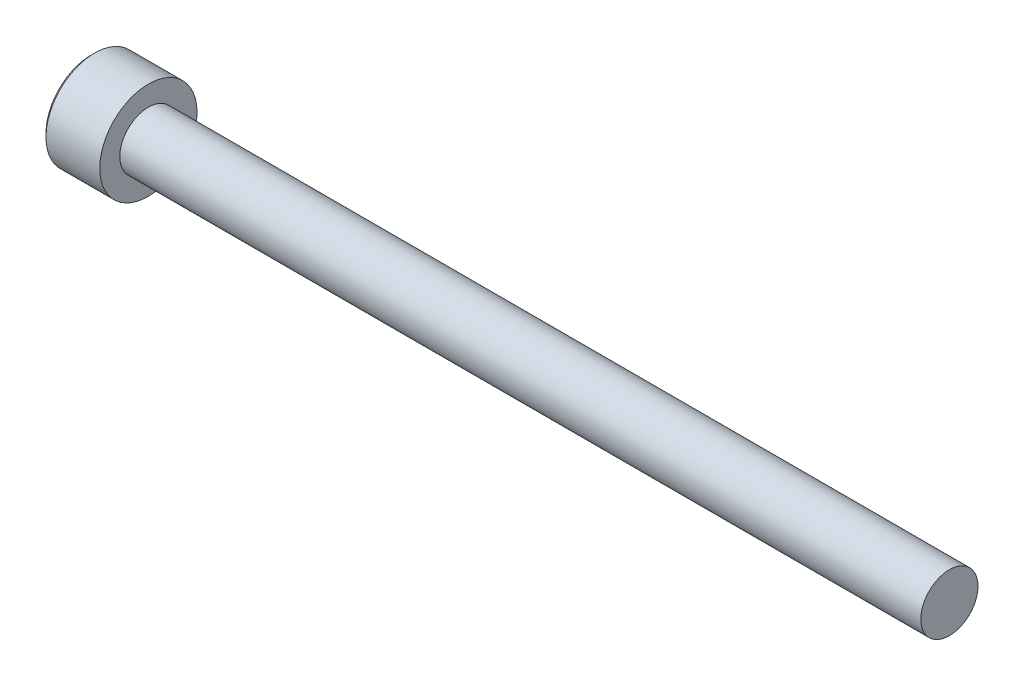
ISO-10303-21;
HEADER;
FILE_DESCRIPTION(('STEP AP214'),'2;1');
FILE_NAME('part.step','',(''),(''),'','','');
FILE_SCHEMA(('AUTOMOTIVE_DESIGN { 1 0 10303 214 1 1 1 1 }'));
ENDSEC;
DATA;
#1=APPLICATION_CONTEXT('core data for automotive mechanical design processes');
#2=APPLICATION_PROTOCOL_DEFINITION('international standard','automotive_design',2000,#1);
#3=PRODUCT_CONTEXT('',#1,'mechanical');
#4=PRODUCT('Part','Part','',(#3));
#5=PRODUCT_RELATED_PRODUCT_CATEGORY('part','',(#4));
#6=PRODUCT_DEFINITION_FORMATION('','',#4);
#7=PRODUCT_DEFINITION_CONTEXT('part definition',#1,'design');
#8=PRODUCT_DEFINITION('design','',#6,#7);
#9=PRODUCT_DEFINITION_SHAPE('','',#8);
#10=(LENGTH_UNIT() NAMED_UNIT(*) SI_UNIT(.MILLI.,.METRE.));
#11=(NAMED_UNIT(*) PLANE_ANGLE_UNIT() SI_UNIT($,.RADIAN.));
#12=(NAMED_UNIT(*) SI_UNIT($,.STERADIAN.) SOLID_ANGLE_UNIT());
#13=UNCERTAINTY_MEASURE_WITH_UNIT(LENGTH_MEASURE(1.E-05),#10,'distance_accuracy_value','');
#14=(GEOMETRIC_REPRESENTATION_CONTEXT(3) GLOBAL_UNCERTAINTY_ASSIGNED_CONTEXT((#13)) GLOBAL_UNIT_ASSIGNED_CONTEXT((#10,
#11,#12)) REPRESENTATION_CONTEXT('',''));
#15=CARTESIAN_POINT('',(0.,0.,0.));
#16=DIRECTION('',(0.,0.,1.));
#17=DIRECTION('',(1.,0.,0.));
#18=AXIS2_PLACEMENT_3D('',#15,#16,#17);
#19=CARTESIAN_POINT('',(-2.5,0.,0.));
#20=DIRECTION('',(-1.,0.,0.));
#21=DIRECTION('',(0.,0.,1.));
#22=AXIS2_PLACEMENT_3D('',#19,#20,#21);
#23=PLANE('',#22);
#24=CARTESIAN_POINT('',(-2.5,0.,0.));
#25=DIRECTION('',(-1.,0.,0.));
#26=DIRECTION('',(0.,-1.,0.));
#27=AXIS2_PLACEMENT_3D('',#24,#25,#26);
#28=CIRCLE('',#27,2.);
#29=CARTESIAN_POINT('',(-2.5,-1.73205080756888,1.));
#30=VERTEX_POINT('',#29);
#31=CARTESIAN_POINT('',(-2.5,0.,2.));
#32=VERTEX_POINT('',#31);
#33=EDGE_CURVE('E47',#30,#32,#28,.T.);
#34=ORIENTED_EDGE('',*,*,#33,.F.);
#35=DIRECTION('',(0.,0.5,0.866025403784439));
#36=VECTOR('',#35,1.);
#37=CARTESIAN_POINT('',(-2.5,-2.3094010767585,0.));
#38=LINE('',#37,#36);
#39=CARTESIAN_POINT('',(-2.5,-1.15470053837925,2.));
#40=VERTEX_POINT('',#39);
#41=EDGE_CURVE('E229',#30,#40,#38,.T.);
#42=ORIENTED_EDGE('',*,*,#41,.T.);
#43=DIRECTION('',(0.,1.,0.));
#44=VECTOR('',#43,1.);
#45=CARTESIAN_POINT('',(-2.5,-1.15470053837925,2.));
#46=LINE('',#45,#44);
#47=EDGE_CURVE('E197',#40,#32,#46,.T.);
#48=ORIENTED_EDGE('',*,*,#47,.T.);
#49=EDGE_LOOP('',(#34,#42,#48));
#50=FACE_BOUND('',#49,.T.);
#51=ADVANCED_FACE('F36',(#50),#23,.T.);
#52=CARTESIAN_POINT('',(-2.5,1.73205080756888,1.));
#53=VERTEX_POINT('',#52);
#54=EDGE_CURVE('E11',#32,#53,#28,.T.);
#55=ORIENTED_EDGE('',*,*,#54,.F.);
#56=CARTESIAN_POINT('',(-2.5,1.15470053837925,2.));
#57=VERTEX_POINT('',#56);
#58=EDGE_CURVE('E225',#32,#57,#46,.T.);
#59=ORIENTED_EDGE('',*,*,#58,.T.);
#60=DIRECTION('',(0.,0.5,-0.866025403784439));
#61=VECTOR('',#60,1.);
#62=CARTESIAN_POINT('',(-2.5,1.15470053837925,2.));
#63=LINE('',#62,#61);
#64=EDGE_CURVE('E242',#57,#53,#63,.T.);
#65=ORIENTED_EDGE('',*,*,#64,.T.);
#66=EDGE_LOOP('',(#55,#59,#65));
#67=FACE_BOUND('',#66,.T.);
#68=ADVANCED_FACE('F123',(#67),#23,.T.);
#69=CARTESIAN_POINT('',(-2.5,1.73205080756888,-1.));
#70=VERTEX_POINT('',#69);
#71=EDGE_CURVE('E45',#53,#70,#28,.T.);
#72=ORIENTED_EDGE('',*,*,#71,.F.);
#73=CARTESIAN_POINT('',(-2.5,2.3094010767585,0.));
#74=VERTEX_POINT('',#73);
#75=EDGE_CURVE('E209',#53,#74,#63,.T.);
#76=ORIENTED_EDGE('',*,*,#75,.T.);
#77=DIRECTION('',(0.,-0.5,-0.866025403784439));
#78=VECTOR('',#77,1.);
#79=CARTESIAN_POINT('',(-2.5,2.3094010767585,0.));
#80=LINE('',#79,#78);
#81=EDGE_CURVE('E238',#74,#70,#80,.T.);
#82=ORIENTED_EDGE('',*,*,#81,.T.);
#83=EDGE_LOOP('',(#72,#76,#82));
#84=FACE_BOUND('',#83,.T.);
#85=ADVANCED_FACE('F128',(#84),#23,.T.);
#86=CARTESIAN_POINT('',(-2.5,0.,-2.));
#87=VERTEX_POINT('',#86);
#88=EDGE_CURVE('E245',#70,#87,#28,.T.);
#89=ORIENTED_EDGE('',*,*,#88,.F.);
#90=CARTESIAN_POINT('',(-2.5,1.15470053837925,-2.));
#91=VERTEX_POINT('',#90);
#92=EDGE_CURVE('E241',#70,#91,#80,.T.);
#93=ORIENTED_EDGE('',*,*,#92,.T.);
#94=DIRECTION('',(0.,-1.,0.));
#95=VECTOR('',#94,1.);
#96=CARTESIAN_POINT('',(-2.5,1.15470053837925,-2.));
#97=LINE('',#96,#95);
#98=EDGE_CURVE('E234',#91,#87,#97,.T.);
#99=ORIENTED_EDGE('',*,*,#98,.T.);
#100=EDGE_LOOP('',(#89,#93,#99));
#101=FACE_BOUND('',#100,.T.);
#102=ADVANCED_FACE('F252',(#101),#23,.T.);
#103=CARTESIAN_POINT('',(-2.5,-1.73205080756888,-1.));
#104=VERTEX_POINT('',#103);
#105=EDGE_CURVE('E54',#87,#104,#28,.T.);
#106=ORIENTED_EDGE('',*,*,#105,.F.);
#107=CARTESIAN_POINT('',(-2.5,-1.15470053837925,-2.));
#108=VERTEX_POINT('',#107);
#109=EDGE_CURVE('E237',#87,#108,#97,.T.);
#110=ORIENTED_EDGE('',*,*,#109,.T.);
#111=DIRECTION('',(0.,-0.5,0.866025403784439));
#112=VECTOR('',#111,1.);
#113=CARTESIAN_POINT('',(-2.5,-1.15470053837925,-2.));
#114=LINE('',#113,#112);
#115=EDGE_CURVE('E230',#108,#104,#114,.T.);
#116=ORIENTED_EDGE('',*,*,#115,.T.);
#117=EDGE_LOOP('',(#106,#110,#116));
#118=FACE_BOUND('',#117,.T.);
#119=ADVANCED_FACE('F121',(#118),#23,.T.);
#120=CARTESIAN_POINT('',(-5.,0.,0.));
#121=DIRECTION('',(1.,0.,0.));
#122=DIRECTION('',(0.,1.,0.));
#123=AXIS2_PLACEMENT_3D('',#120,#121,#122);
#124=PLANE('',#123);
#125=DIRECTION('',(0.,-0.5,-0.866025403784439));
#126=VECTOR('',#125,1.);
#127=CARTESIAN_POINT('',(-5.,2.3094010767585,0.));
#128=LINE('',#127,#126);
#129=CARTESIAN_POINT('',(-5.,2.3094010767585,0.));
#130=VERTEX_POINT('',#129);
#131=CARTESIAN_POINT('',(-5.,1.15470053837925,-2.));
#132=VERTEX_POINT('',#131);
#133=EDGE_CURVE('E219',#130,#132,#128,.T.);
#134=ORIENTED_EDGE('',*,*,#133,.F.);
#135=DIRECTION('',(0.,0.5,-0.866025403784439));
#136=VECTOR('',#135,1.);
#137=CARTESIAN_POINT('',(-5.,1.15470053837925,2.));
#138=LINE('',#137,#136);
#139=CARTESIAN_POINT('',(-5.,1.15470053837925,2.));
#140=VERTEX_POINT('',#139);
#141=EDGE_CURVE('E62',#140,#130,#138,.T.);
#142=ORIENTED_EDGE('',*,*,#141,.F.);
#143=DIRECTION('',(0.,1.,0.));
#144=VECTOR('',#143,1.);
#145=CARTESIAN_POINT('',(-5.,-1.15470053837925,2.));
#146=LINE('',#145,#144);
#147=CARTESIAN_POINT('',(-5.,-1.15470053837925,2.));
#148=VERTEX_POINT('',#147);
#149=EDGE_CURVE('E206',#148,#140,#146,.T.);
#150=ORIENTED_EDGE('',*,*,#149,.F.);
#151=DIRECTION('',(0.,0.5,0.866025403784439));
#152=VECTOR('',#151,1.);
#153=CARTESIAN_POINT('',(-5.,-2.3094010767585,0.));
#154=LINE('',#153,#152);
#155=CARTESIAN_POINT('',(-5.,-2.3094010767585,0.));
#156=VERTEX_POINT('',#155);
#157=EDGE_CURVE('E210',#156,#148,#154,.T.);
#158=ORIENTED_EDGE('',*,*,#157,.F.);
#159=DIRECTION('',(0.,-0.5,0.866025403784439));
#160=VECTOR('',#159,1.);
#161=CARTESIAN_POINT('',(-5.,-1.15470053837925,-2.));
#162=LINE('',#161,#160);
#163=CARTESIAN_POINT('',(-5.,-1.15470053837925,-2.));
#164=VERTEX_POINT('',#163);
#165=EDGE_CURVE('E213',#164,#156,#162,.T.);
#166=ORIENTED_EDGE('',*,*,#165,.F.);
#167=DIRECTION('',(0.,-1.,0.));
#168=VECTOR('',#167,1.);
#169=CARTESIAN_POINT('',(-5.,1.15470053837925,-2.));
#170=LINE('',#169,#168);
#171=EDGE_CURVE('E216',#132,#164,#170,.T.);
#172=ORIENTED_EDGE('',*,*,#171,.F.);
#173=EDGE_LOOP('',(#134,#142,#150,#158,#166,#172));
#174=FACE_BOUND('',#173,.T.);
#175=CARTESIAN_POINT('',(-5.,0.,0.));
#176=DIRECTION('',(-1.,0.,0.));
#177=DIRECTION('',(0.,-1.,0.));
#178=AXIS2_PLACEMENT_3D('',#175,#176,#177);
#179=CIRCLE('',#178,3.95);
#180=CARTESIAN_POINT('',(-5.,-3.95,0.));
#181=VERTEX_POINT('',#180);
#182=EDGE_CURVE('E40',#181,#181,#179,.T.);
#183=ORIENTED_EDGE('',*,*,#182,.T.);
#184=EDGE_LOOP('',(#183));
#185=FACE_BOUND('',#184,.T.);
#186=ADVANCED_FACE('F38',(#174,#185),#124,.F.);
#187=CARTESIAN_POINT('',(-4.7,0.,0.));
#188=DIRECTION('',(1.,0.,0.));
#189=DIRECTION('',(0.,1.,0.));
#190=AXIS2_PLACEMENT_3D('',#187,#188,#189);
#191=CONICAL_SURFACE('',#190,4.25,0.785398163397448);
#192=ORIENTED_EDGE('',*,*,#182,.F.);
#193=EDGE_LOOP('',(#192));
#194=FACE_BOUND('',#193,.T.);
#195=CARTESIAN_POINT('',(-4.7,0.,0.));
#196=DIRECTION('',(-1.,0.,0.));
#197=DIRECTION('',(0.,-1.,0.));
#198=AXIS2_PLACEMENT_3D('',#195,#196,#197);
#199=CIRCLE('',#198,4.25);
#200=CARTESIAN_POINT('',(-4.7,-4.25,0.));
#201=VERTEX_POINT('',#200);
#202=EDGE_CURVE('E181',#201,#201,#199,.T.);
#203=ORIENTED_EDGE('',*,*,#202,.T.);
#204=EDGE_LOOP('',(#203));
#205=FACE_BOUND('',#204,.T.);
#206=ADVANCED_FACE('F168',(#194,#205),#191,.T.);
#207=CARTESIAN_POINT('',(-5.,0.,0.));
#208=DIRECTION('',(-1.,0.,0.));
#209=DIRECTION('',(0.,-1.,0.));
#210=AXIS2_PLACEMENT_3D('',#207,#208,#209);
#211=CYLINDRICAL_SURFACE('',#210,4.25);
#212=ORIENTED_EDGE('',*,*,#202,.F.);
#213=EDGE_LOOP('',(#212));
#214=FACE_BOUND('',#213,.T.);
#215=CARTESIAN_POINT('',(0.,0.,0.));
#216=DIRECTION('',(-1.,0.,0.));
#217=DIRECTION('',(0.,-1.,0.));
#218=AXIS2_PLACEMENT_3D('',#215,#216,#217);
#219=CIRCLE('',#218,4.25);
#220=CARTESIAN_POINT('',(0.,-4.25,0.));
#221=VERTEX_POINT('',#220);
#222=EDGE_CURVE('E182',#221,#221,#219,.T.);
#223=ORIENTED_EDGE('',*,*,#222,.T.);
#224=EDGE_LOOP('',(#223));
#225=FACE_BOUND('',#224,.T.);
#226=ADVANCED_FACE('F165',(#214,#225),#211,.T.);
#227=CARTESIAN_POINT('',(0.,4.25,0.));
#228=DIRECTION('',(-1.,0.,0.));
#229=DIRECTION('',(0.,-1.,0.));
#230=AXIS2_PLACEMENT_3D('',#227,#228,#229);
#231=PLANE('',#230);
#232=ORIENTED_EDGE('',*,*,#222,.F.);
#233=EDGE_LOOP('',(#232));
#234=FACE_BOUND('',#233,.T.);
#235=CARTESIAN_POINT('',(0.,0.,0.));
#236=DIRECTION('',(-1.,0.,0.));
#237=DIRECTION('',(0.,-1.,0.));
#238=AXIS2_PLACEMENT_3D('',#235,#236,#237);
#239=CIRCLE('',#238,2.5);
#240=CARTESIAN_POINT('',(0.,-2.5,0.));
#241=VERTEX_POINT('',#240);
#242=EDGE_CURVE('E185',#241,#241,#239,.T.);
#243=ORIENTED_EDGE('',*,*,#242,.T.);
#244=EDGE_LOOP('',(#243));
#245=FACE_BOUND('',#244,.T.);
#246=ADVANCED_FACE('F161',(#234,#245),#231,.F.);
#247=CARTESIAN_POINT('',(-5.,0.,0.));
#248=DIRECTION('',(-1.,0.,0.));
#249=DIRECTION('',(0.,-1.,0.));
#250=AXIS2_PLACEMENT_3D('',#247,#248,#249);
#251=CYLINDRICAL_SURFACE('',#250,2.5);
#252=ORIENTED_EDGE('',*,*,#242,.F.);
#253=EDGE_LOOP('',(#252));
#254=FACE_BOUND('',#253,.T.);
#255=CARTESIAN_POINT('',(70.,0.,0.));
#256=DIRECTION('',(-1.,0.,0.));
#257=DIRECTION('',(0.,-1.,0.));
#258=AXIS2_PLACEMENT_3D('',#255,#256,#257);
#259=CIRCLE('',#258,2.5);
#260=CARTESIAN_POINT('',(70.,-2.5,0.));
#261=VERTEX_POINT('',#260);
#262=EDGE_CURVE('E190',#261,#261,#259,.T.);
#263=ORIENTED_EDGE('',*,*,#262,.T.);
#264=EDGE_LOOP('',(#263));
#265=FACE_BOUND('',#264,.T.);
#266=ADVANCED_FACE('F157',(#254,#265),#251,.T.);
#267=CARTESIAN_POINT('',(70.,2.5,0.));
#268=DIRECTION('',(-1.,0.,0.));
#269=DIRECTION('',(0.,-1.,0.));
#270=AXIS2_PLACEMENT_3D('',#267,#268,#269);
#271=PLANE('',#270);
#272=ORIENTED_EDGE('',*,*,#262,.F.);
#273=EDGE_LOOP('',(#272));
#274=FACE_BOUND('',#273,.T.);
#275=ADVANCED_FACE('F154',(#274),#271,.F.);
#276=CARTESIAN_POINT('',(-2.5,1.15470053837925,2.));
#277=DIRECTION('',(0.,0.866025403784439,0.5));
#278=DIRECTION('',(0.,-0.5,0.866025403784439));
#279=AXIS2_PLACEMENT_3D('',#276,#277,#278);
#280=PLANE('',#279);
#281=ORIENTED_EDGE('',*,*,#141,.T.);
#282=DIRECTION('',(-1.,0.,0.));
#283=VECTOR('',#282,1.);
#284=CARTESIAN_POINT('',(-2.5,2.3094010767585,0.));
#285=LINE('',#284,#283);
#286=EDGE_CURVE('E194',#74,#130,#285,.T.);
#287=ORIENTED_EDGE('',*,*,#286,.F.);
#288=ORIENTED_EDGE('',*,*,#75,.F.);
#289=ORIENTED_EDGE('',*,*,#64,.F.);
#290=DIRECTION('',(-1.,0.,0.));
#291=VECTOR('',#290,1.);
#292=CARTESIAN_POINT('',(-2.5,1.15470053837925,2.));
#293=LINE('',#292,#291);
#294=EDGE_CURVE('E193',#57,#140,#293,.T.);
#295=ORIENTED_EDGE('',*,*,#294,.T.);
#296=EDGE_LOOP('',(#281,#287,#288,#289,#295));
#297=FACE_BOUND('',#296,.T.);
#298=ADVANCED_FACE('F136',(#297),#280,.F.);
#299=CARTESIAN_POINT('',(-2.5,-1.15470053837925,2.));
#300=DIRECTION('',(0.,0.,1.));
#301=DIRECTION('',(0.,-1.,0.));
#302=AXIS2_PLACEMENT_3D('',#299,#300,#301);
#303=PLANE('',#302);
#304=ORIENTED_EDGE('',*,*,#149,.T.);
#305=ORIENTED_EDGE('',*,*,#294,.F.);
#306=ORIENTED_EDGE('',*,*,#58,.F.);
#307=ORIENTED_EDGE('',*,*,#47,.F.);
#308=DIRECTION('',(-1.,0.,0.));
#309=VECTOR('',#308,1.);
#310=CARTESIAN_POINT('',(-2.5,-1.15470053837925,2.));
#311=LINE('',#310,#309);
#312=EDGE_CURVE('E203',#40,#148,#311,.T.);
#313=ORIENTED_EDGE('',*,*,#312,.T.);
#314=EDGE_LOOP('',(#304,#305,#306,#307,#313));
#315=FACE_BOUND('',#314,.T.);
#316=ADVANCED_FACE('F132',(#315),#303,.F.);
#317=CARTESIAN_POINT('',(-2.5,-2.3094010767585,0.));
#318=DIRECTION('',(0.,-0.866025403784439,0.5));
#319=DIRECTION('',(0.,-0.5,-0.866025403784439));
#320=AXIS2_PLACEMENT_3D('',#317,#318,#319);
#321=PLANE('',#320);
#322=ORIENTED_EDGE('',*,*,#157,.T.);
#323=ORIENTED_EDGE('',*,*,#312,.F.);
#324=ORIENTED_EDGE('',*,*,#41,.F.);
#325=CARTESIAN_POINT('',(-2.5,-2.3094010767585,0.));
#326=VERTEX_POINT('',#325);
#327=EDGE_CURVE('E226',#326,#30,#38,.T.);
#328=ORIENTED_EDGE('',*,*,#327,.F.);
#329=DIRECTION('',(-1.,0.,0.));
#330=VECTOR('',#329,1.);
#331=CARTESIAN_POINT('',(-2.5,-2.3094010767585,0.));
#332=LINE('',#331,#330);
#333=EDGE_CURVE('E201',#326,#156,#332,.T.);
#334=ORIENTED_EDGE('',*,*,#333,.T.);
#335=EDGE_LOOP('',(#322,#323,#324,#328,#334));
#336=FACE_BOUND('',#335,.T.);
#337=ADVANCED_FACE('F135',(#336),#321,.F.);
#338=CARTESIAN_POINT('',(-2.5,-1.15470053837925,-2.));
#339=DIRECTION('',(0.,-0.866025403784439,-0.5));
#340=DIRECTION('',(0.,0.5,-0.866025403784439));
#341=AXIS2_PLACEMENT_3D('',#338,#339,#340);
#342=PLANE('',#341);
#343=ORIENTED_EDGE('',*,*,#165,.T.);
#344=ORIENTED_EDGE('',*,*,#333,.F.);
#345=EDGE_CURVE('E233',#104,#326,#114,.T.);
#346=ORIENTED_EDGE('',*,*,#345,.F.);
#347=ORIENTED_EDGE('',*,*,#115,.F.);
#348=DIRECTION('',(-1.,0.,0.));
#349=VECTOR('',#348,1.);
#350=CARTESIAN_POINT('',(-2.5,-1.15470053837925,-2.));
#351=LINE('',#350,#349);
#352=EDGE_CURVE('E199',#108,#164,#351,.T.);
#353=ORIENTED_EDGE('',*,*,#352,.T.);
#354=EDGE_LOOP('',(#343,#344,#346,#347,#353));
#355=FACE_BOUND('',#354,.T.);
#356=ADVANCED_FACE('F140',(#355),#342,.F.);
#357=CARTESIAN_POINT('',(-2.5,1.15470053837925,-2.));
#358=DIRECTION('',(0.,0.,-1.));
#359=DIRECTION('',(-1.,0.,0.));
#360=AXIS2_PLACEMENT_3D('',#357,#358,#359);
#361=PLANE('',#360);
#362=ORIENTED_EDGE('',*,*,#171,.T.);
#363=ORIENTED_EDGE('',*,*,#352,.F.);
#364=ORIENTED_EDGE('',*,*,#109,.F.);
#365=ORIENTED_EDGE('',*,*,#98,.F.);
#366=DIRECTION('',(-1.,0.,0.));
#367=VECTOR('',#366,1.);
#368=CARTESIAN_POINT('',(-2.5,1.15470053837925,-2.));
#369=LINE('',#368,#367);
#370=EDGE_CURVE('E196',#91,#132,#369,.T.);
#371=ORIENTED_EDGE('',*,*,#370,.T.);
#372=EDGE_LOOP('',(#362,#363,#364,#365,#371));
#373=FACE_BOUND('',#372,.T.);
#374=ADVANCED_FACE('F144',(#373),#361,.F.);
#375=CARTESIAN_POINT('',(-2.5,2.3094010767585,0.));
#376=DIRECTION('',(0.,0.866025403784439,-0.5));
#377=DIRECTION('',(0.,0.5,0.866025403784439));
#378=AXIS2_PLACEMENT_3D('',#375,#376,#377);
#379=PLANE('',#378);
#380=ORIENTED_EDGE('',*,*,#133,.T.);
#381=ORIENTED_EDGE('',*,*,#370,.F.);
#382=ORIENTED_EDGE('',*,*,#92,.F.);
#383=ORIENTED_EDGE('',*,*,#81,.F.);
#384=ORIENTED_EDGE('',*,*,#286,.T.);
#385=EDGE_LOOP('',(#380,#381,#382,#383,#384));
#386=FACE_BOUND('',#385,.T.);
#387=ADVANCED_FACE('F118',(#386),#379,.F.);
#388=EDGE_CURVE('E183',#104,#30,#28,.T.);
#389=ORIENTED_EDGE('',*,*,#388,.F.);
#390=ORIENTED_EDGE('',*,*,#345,.T.);
#391=ORIENTED_EDGE('',*,*,#327,.T.);
#392=EDGE_LOOP('',(#389,#390,#391));
#393=FACE_BOUND('',#392,.T.);
#394=ADVANCED_FACE('F113',(#393),#23,.T.);
#395=CARTESIAN_POINT('',(-1.29827876194487,0.,0.));
#396=DIRECTION('',(-1.,0.,0.));
#397=DIRECTION('',(0.,-1.,0.));
#398=AXIS2_PLACEMENT_3D('',#395,#396,#397);
#399=CONICAL_SURFACE('',#398,0.,1.02974425867665);
#400=ORIENTED_EDGE('',*,*,#33,.T.);
#401=ORIENTED_EDGE('',*,*,#54,.T.);
#402=ORIENTED_EDGE('',*,*,#71,.T.);
#403=ORIENTED_EDGE('',*,*,#88,.T.);
#404=ORIENTED_EDGE('',*,*,#105,.T.);
#405=ORIENTED_EDGE('',*,*,#388,.T.);
#406=EDGE_LOOP('',(#400,#401,#402,#403,#404,#405));
#407=FACE_BOUND('',#406,.T.);
#408=CARTESIAN_POINT('',(-1.29827876194487,0.,0.));
#409=VERTEX_POINT('',#408);
#410=VERTEX_LOOP('',#409);
#411=FACE_BOUND('',#410,.T.);
#412=ADVANCED_FACE('F111',(#407,#411),#399,.F.);
#413=CLOSED_SHELL('',(#51,#68,#85,#102,#119,#186,#206,#226,#246,#266,#275,#298,#316,#337,#356,
#374,#387,#394,#412));
#414=MANIFOLD_SOLID_BREP('B2',#413);
#415=ADVANCED_BREP_SHAPE_REPRESENTATION('',(#18,#414),#14);
#416=SHAPE_DEFINITION_REPRESENTATION(#9,#415);
ENDSEC;
END-ISO-10303-21;
